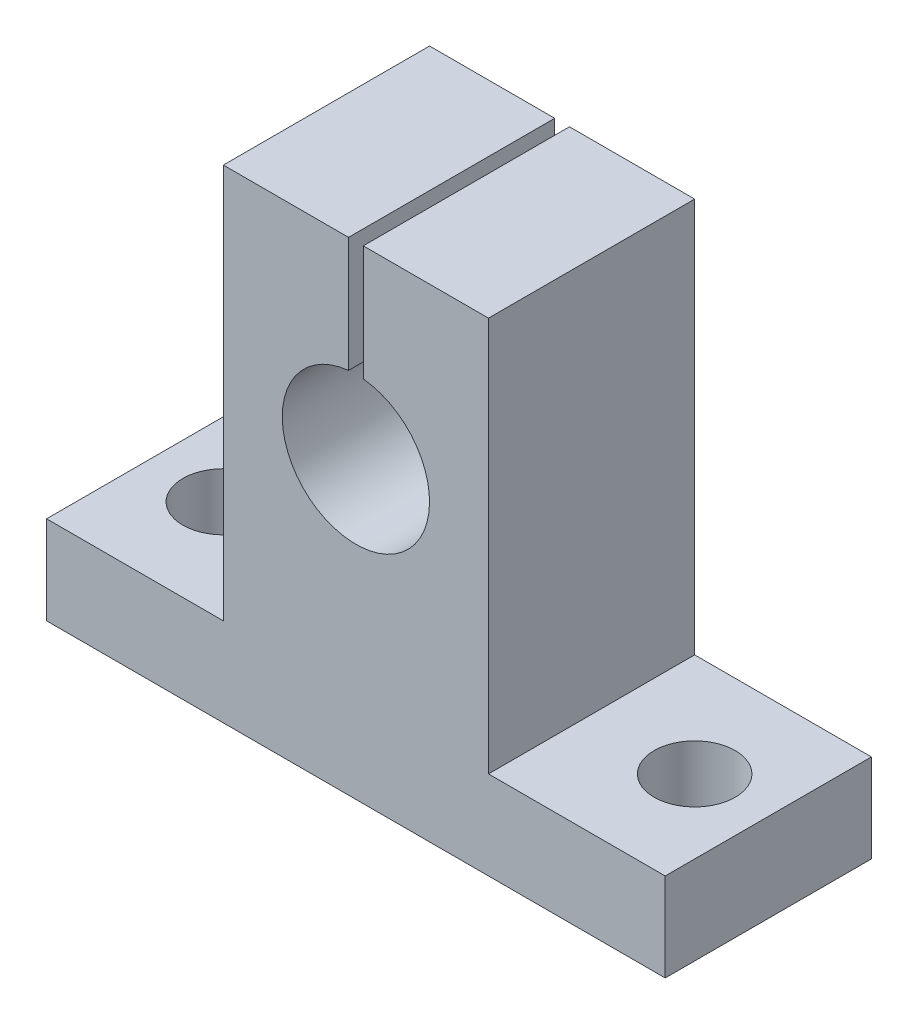
ISO-10303-21;
HEADER;
FILE_DESCRIPTION(('STEP AP214'),'2;1');
FILE_NAME('part.step','',(''),(''),'','','');
FILE_SCHEMA(('AUTOMOTIVE_DESIGN { 1 0 10303 214 1 1 1 1 }'));
ENDSEC;
DATA;
#1=APPLICATION_CONTEXT('core data for automotive mechanical design processes');
#2=APPLICATION_PROTOCOL_DEFINITION('international standard','automotive_design',2000,#1);
#3=PRODUCT_CONTEXT('',#1,'mechanical');
#4=PRODUCT('Part','Part','',(#3));
#5=PRODUCT_RELATED_PRODUCT_CATEGORY('part','',(#4));
#6=PRODUCT_DEFINITION_FORMATION('','',#4);
#7=PRODUCT_DEFINITION_CONTEXT('part definition',#1,'design');
#8=PRODUCT_DEFINITION('design','',#6,#7);
#9=PRODUCT_DEFINITION_SHAPE('','',#8);
#10=(LENGTH_UNIT() NAMED_UNIT(*) SI_UNIT(.MILLI.,.METRE.));
#11=(NAMED_UNIT(*) PLANE_ANGLE_UNIT() SI_UNIT($,.RADIAN.));
#12=(NAMED_UNIT(*) SI_UNIT($,.STERADIAN.) SOLID_ANGLE_UNIT());
#13=UNCERTAINTY_MEASURE_WITH_UNIT(LENGTH_MEASURE(1.E-05),#10,'distance_accuracy_value','');
#14=(GEOMETRIC_REPRESENTATION_CONTEXT(3) GLOBAL_UNCERTAINTY_ASSIGNED_CONTEXT((#13)) GLOBAL_UNIT_ASSIGNED_CONTEXT((#10,
#11,#12)) REPRESENTATION_CONTEXT('',''));
#15=CARTESIAN_POINT('',(0.,0.,0.));
#16=DIRECTION('',(0.,0.,1.));
#17=DIRECTION('',(1.,0.,0.));
#18=AXIS2_PLACEMENT_3D('',#15,#16,#17);
#19=CARTESIAN_POINT('',(0.,0.,14.));
#20=DIRECTION('',(0.,0.,-1.));
#21=DIRECTION('',(-1.,0.,0.));
#22=AXIS2_PLACEMENT_3D('',#19,#20,#21);
#23=CYLINDRICAL_SURFACE('',#22,5.);
#24=CARTESIAN_POINT('',(0.,0.,0.));
#25=DIRECTION('',(0.,0.,1.));
#26=DIRECTION('',(1.,0.,0.));
#27=AXIS2_PLACEMENT_3D('',#24,#25,#26);
#28=CIRCLE('',#27,5.);
#29=CARTESIAN_POINT('',(-0.5,4.9749371855331,0.));
#30=VERTEX_POINT('',#29);
#31=CARTESIAN_POINT('',(0.5,4.9749371855331,0.));
#32=VERTEX_POINT('',#31);
#33=EDGE_CURVE('E176',#30,#32,#28,.T.);
#34=ORIENTED_EDGE('',*,*,#33,.F.);
#35=DIRECTION('',(0.,0.,-1.));
#36=VECTOR('',#35,1.);
#37=CARTESIAN_POINT('',(-0.5,4.9749371855331,14.));
#38=LINE('',#37,#36);
#39=CARTESIAN_POINT('',(-0.5,4.9749371855331,14.));
#40=VERTEX_POINT('',#39);
#41=EDGE_CURVE('E11',#40,#30,#38,.T.);
#42=ORIENTED_EDGE('',*,*,#41,.F.);
#43=CARTESIAN_POINT('',(0.,0.,14.));
#44=DIRECTION('',(0.,0.,1.));
#45=DIRECTION('',(1.,0.,0.));
#46=AXIS2_PLACEMENT_3D('',#43,#44,#45);
#47=CIRCLE('',#46,5.);
#48=CARTESIAN_POINT('',(0.5,4.9749371855331,14.));
#49=VERTEX_POINT('',#48);
#50=EDGE_CURVE('E163',#40,#49,#47,.T.);
#51=ORIENTED_EDGE('',*,*,#50,.T.);
#52=DIRECTION('',(0.,0.,-1.));
#53=VECTOR('',#52,1.);
#54=CARTESIAN_POINT('',(0.5,4.9749371855331,14.));
#55=LINE('',#54,#53);
#56=EDGE_CURVE('E53',#49,#32,#55,.T.);
#57=ORIENTED_EDGE('',*,*,#56,.T.);
#58=EDGE_LOOP('',(#34,#42,#51,#57));
#59=FACE_BOUND('',#58,.T.);
#60=ADVANCED_FACE('F37',(#59),#23,.F.);
#61=CARTESIAN_POINT('',(-0.5,0.,14.));
#62=DIRECTION('',(1.,0.,0.));
#63=DIRECTION('',(0.,0.,-1.));
#64=AXIS2_PLACEMENT_3D('',#61,#62,#63);
#65=PLANE('',#64);
#66=DIRECTION('',(0.,-1.,0.));
#67=VECTOR('',#66,1.);
#68=CARTESIAN_POINT('',(-0.5,0.,0.));
#69=LINE('',#68,#67);
#70=CARTESIAN_POINT('',(-0.5,12.8,0.));
#71=VERTEX_POINT('',#70);
#72=EDGE_CURVE('E235',#71,#30,#69,.T.);
#73=ORIENTED_EDGE('',*,*,#72,.F.);
#74=DIRECTION('',(0.,0.,-1.));
#75=VECTOR('',#74,1.);
#76=CARTESIAN_POINT('',(-0.5,12.8,14.));
#77=LINE('',#76,#75);
#78=CARTESIAN_POINT('',(-0.5,12.8,14.));
#79=VERTEX_POINT('',#78);
#80=EDGE_CURVE('E45',#79,#71,#77,.T.);
#81=ORIENTED_EDGE('',*,*,#80,.F.);
#82=DIRECTION('',(0.,-1.,0.));
#83=VECTOR('',#82,1.);
#84=CARTESIAN_POINT('',(-0.5,0.,14.));
#85=LINE('',#84,#83);
#86=EDGE_CURVE('E157',#79,#40,#85,.T.);
#87=ORIENTED_EDGE('',*,*,#86,.T.);
#88=ORIENTED_EDGE('',*,*,#41,.T.);
#89=EDGE_LOOP('',(#73,#81,#87,#88));
#90=FACE_BOUND('',#89,.T.);
#91=ADVANCED_FACE('F236',(#90),#65,.T.);
#92=CARTESIAN_POINT('',(0.,12.8,14.));
#93=DIRECTION('',(0.,1.,0.));
#94=DIRECTION('',(0.,0.,1.));
#95=AXIS2_PLACEMENT_3D('',#92,#93,#94);
#96=PLANE('',#95);
#97=DIRECTION('',(1.,0.,0.));
#98=VECTOR('',#97,1.);
#99=CARTESIAN_POINT('',(0.,12.8,0.));
#100=LINE('',#99,#98);
#101=CARTESIAN_POINT('',(-9.,12.8,0.));
#102=VERTEX_POINT('',#101);
#103=EDGE_CURVE('E212',#102,#71,#100,.T.);
#104=ORIENTED_EDGE('',*,*,#103,.F.);
#105=DIRECTION('',(0.,0.,-1.));
#106=VECTOR('',#105,1.);
#107=CARTESIAN_POINT('',(-9.,12.8,14.));
#108=LINE('',#107,#106);
#109=CARTESIAN_POINT('',(-9.,12.8,14.));
#110=VERTEX_POINT('',#109);
#111=EDGE_CURVE('E228',#110,#102,#108,.T.);
#112=ORIENTED_EDGE('',*,*,#111,.F.);
#113=DIRECTION('',(1.,0.,0.));
#114=VECTOR('',#113,1.);
#115=CARTESIAN_POINT('',(0.,12.8,14.));
#116=LINE('',#115,#114);
#117=EDGE_CURVE('E151',#110,#79,#116,.T.);
#118=ORIENTED_EDGE('',*,*,#117,.T.);
#119=ORIENTED_EDGE('',*,*,#80,.T.);
#120=EDGE_LOOP('',(#104,#112,#118,#119));
#121=FACE_BOUND('',#120,.T.);
#122=ADVANCED_FACE('F231',(#121),#96,.T.);
#123=CARTESIAN_POINT('',(-8.99999999999999,0.,14.));
#124=DIRECTION('',(-1.,0.,0.));
#125=DIRECTION('',(0.,-1.,0.));
#126=AXIS2_PLACEMENT_3D('',#123,#124,#125);
#127=PLANE('',#126);
#128=DIRECTION('',(0.,1.,0.));
#129=VECTOR('',#128,1.);
#130=CARTESIAN_POINT('',(-8.99999999999999,0.,0.));
#131=LINE('',#130,#129);
#132=CARTESIAN_POINT('',(-8.99999999999999,-14.,0.));
#133=VERTEX_POINT('',#132);
#134=EDGE_CURVE('E240',#133,#102,#131,.T.);
#135=ORIENTED_EDGE('',*,*,#134,.F.);
#136=DIRECTION('',(0.,0.,-1.));
#137=VECTOR('',#136,1.);
#138=CARTESIAN_POINT('',(-8.99999999999999,-14.,14.));
#139=LINE('',#138,#137);
#140=CARTESIAN_POINT('',(-8.99999999999999,-14.,14.));
#141=VERTEX_POINT('',#140);
#142=EDGE_CURVE('E226',#141,#133,#139,.T.);
#143=ORIENTED_EDGE('',*,*,#142,.F.);
#144=DIRECTION('',(0.,1.,0.));
#145=VECTOR('',#144,1.);
#146=CARTESIAN_POINT('',(-8.99999999999999,0.,14.));
#147=LINE('',#146,#145);
#148=EDGE_CURVE('E156',#141,#110,#147,.T.);
#149=ORIENTED_EDGE('',*,*,#148,.T.);
#150=ORIENTED_EDGE('',*,*,#111,.T.);
#151=EDGE_LOOP('',(#135,#143,#149,#150));
#152=FACE_BOUND('',#151,.T.);
#153=ADVANCED_FACE('F272',(#152),#127,.T.);
#154=CARTESIAN_POINT('',(0.,-14.,14.));
#155=DIRECTION('',(0.,1.,0.));
#156=DIRECTION('',(0.,0.,1.));
#157=AXIS2_PLACEMENT_3D('',#154,#155,#156);
#158=PLANE('',#157);
#159=CARTESIAN_POINT('',(-16.,-14.,7.));
#160=DIRECTION('',(0.,1.,0.));
#161=DIRECTION('',(0.,0.,1.));
#162=AXIS2_PLACEMENT_3D('',#159,#160,#161);
#163=CIRCLE('',#162,2.75);
#164=CARTESIAN_POINT('',(-16.,-14.,9.75));
#165=VERTEX_POINT('',#164);
#166=EDGE_CURVE('E169',#165,#165,#163,.T.);
#167=ORIENTED_EDGE('',*,*,#166,.F.);
#168=EDGE_LOOP('',(#167));
#169=FACE_BOUND('',#168,.T.);
#170=DIRECTION('',(1.,0.,0.));
#171=VECTOR('',#170,1.);
#172=CARTESIAN_POINT('',(0.,-14.,0.));
#173=LINE('',#172,#171);
#174=CARTESIAN_POINT('',(-21.,-14.,0.));
#175=VERTEX_POINT('',#174);
#176=EDGE_CURVE('E241',#175,#133,#173,.T.);
#177=ORIENTED_EDGE('',*,*,#176,.F.);
#178=DIRECTION('',(0.,0.,-1.));
#179=VECTOR('',#178,1.);
#180=CARTESIAN_POINT('',(-21.,-14.,14.));
#181=LINE('',#180,#179);
#182=CARTESIAN_POINT('',(-21.,-14.,14.));
#183=VERTEX_POINT('',#182);
#184=EDGE_CURVE('E224',#183,#175,#181,.T.);
#185=ORIENTED_EDGE('',*,*,#184,.F.);
#186=DIRECTION('',(1.,0.,0.));
#187=VECTOR('',#186,1.);
#188=CARTESIAN_POINT('',(0.,-14.,14.));
#189=LINE('',#188,#187);
#190=EDGE_CURVE('E161',#183,#141,#189,.T.);
#191=ORIENTED_EDGE('',*,*,#190,.T.);
#192=ORIENTED_EDGE('',*,*,#142,.T.);
#193=EDGE_LOOP('',(#177,#185,#191,#192));
#194=FACE_BOUND('',#193,.T.);
#195=ADVANCED_FACE('F267',(#169,#194),#158,.T.);
#196=CARTESIAN_POINT('',(-21.,0.,14.));
#197=DIRECTION('',(-1.,0.,0.));
#198=DIRECTION('',(0.,0.,1.));
#199=AXIS2_PLACEMENT_3D('',#196,#197,#198);
#200=PLANE('',#199);
#201=DIRECTION('',(0.,1.,0.));
#202=VECTOR('',#201,1.);
#203=CARTESIAN_POINT('',(-21.,0.,0.));
#204=LINE('',#203,#202);
#205=CARTESIAN_POINT('',(-21.,-20.,0.));
#206=VERTEX_POINT('',#205);
#207=EDGE_CURVE('E246',#206,#175,#204,.T.);
#208=ORIENTED_EDGE('',*,*,#207,.F.);
#209=DIRECTION('',(0.,0.,-1.));
#210=VECTOR('',#209,1.);
#211=CARTESIAN_POINT('',(-21.,-20.,14.));
#212=LINE('',#211,#210);
#213=CARTESIAN_POINT('',(-21.,-20.,14.));
#214=VERTEX_POINT('',#213);
#215=EDGE_CURVE('E222',#214,#206,#212,.T.);
#216=ORIENTED_EDGE('',*,*,#215,.F.);
#217=DIRECTION('',(0.,1.,0.));
#218=VECTOR('',#217,1.);
#219=CARTESIAN_POINT('',(-21.,0.,14.));
#220=LINE('',#219,#218);
#221=EDGE_CURVE('E264',#214,#183,#220,.T.);
#222=ORIENTED_EDGE('',*,*,#221,.T.);
#223=ORIENTED_EDGE('',*,*,#184,.T.);
#224=EDGE_LOOP('',(#208,#216,#222,#223));
#225=FACE_BOUND('',#224,.T.);
#226=ADVANCED_FACE('F263',(#225),#200,.T.);
#227=CARTESIAN_POINT('',(0.,-20.,14.));
#228=DIRECTION('',(0.,1.,0.));
#229=DIRECTION('',(-1.,0.,0.));
#230=AXIS2_PLACEMENT_3D('',#227,#228,#229);
#231=PLANE('',#230);
#232=CARTESIAN_POINT('',(16.,-20.,7.));
#233=DIRECTION('',(0.,1.,0.));
#234=DIRECTION('',(0.,0.,1.));
#235=AXIS2_PLACEMENT_3D('',#232,#233,#234);
#236=CIRCLE('',#235,2.75);
#237=CARTESIAN_POINT('',(16.,-20.,9.75));
#238=VERTEX_POINT('',#237);
#239=EDGE_CURVE('E173',#238,#238,#236,.T.);
#240=ORIENTED_EDGE('',*,*,#239,.T.);
#241=EDGE_LOOP('',(#240));
#242=FACE_BOUND('',#241,.T.);
#243=CARTESIAN_POINT('',(-16.,-20.,7.));
#244=DIRECTION('',(0.,1.,0.));
#245=DIRECTION('',(0.,0.,1.));
#246=AXIS2_PLACEMENT_3D('',#243,#244,#245);
#247=CIRCLE('',#246,2.75);
#248=CARTESIAN_POINT('',(-16.,-20.,9.75));
#249=VERTEX_POINT('',#248);
#250=EDGE_CURVE('E172',#249,#249,#247,.T.);
#251=ORIENTED_EDGE('',*,*,#250,.T.);
#252=EDGE_LOOP('',(#251));
#253=FACE_BOUND('',#252,.T.);
#254=DIRECTION('',(1.,0.,0.));
#255=VECTOR('',#254,1.);
#256=CARTESIAN_POINT('',(0.,-20.,0.));
#257=LINE('',#256,#255);
#258=CARTESIAN_POINT('',(21.,-20.,0.));
#259=VERTEX_POINT('',#258);
#260=EDGE_CURVE('E249',#206,#259,#257,.T.);
#261=ORIENTED_EDGE('',*,*,#260,.T.);
#262=DIRECTION('',(0.,0.,-1.));
#263=VECTOR('',#262,1.);
#264=CARTESIAN_POINT('',(21.,-20.,14.));
#265=LINE('',#264,#263);
#266=CARTESIAN_POINT('',(21.,-20.,14.));
#267=VERTEX_POINT('',#266);
#268=EDGE_CURVE('E220',#267,#259,#265,.T.);
#269=ORIENTED_EDGE('',*,*,#268,.F.);
#270=DIRECTION('',(1.,0.,0.));
#271=VECTOR('',#270,1.);
#272=CARTESIAN_POINT('',(0.,-20.,14.));
#273=LINE('',#272,#271);
#274=EDGE_CURVE('E259',#214,#267,#273,.T.);
#275=ORIENTED_EDGE('',*,*,#274,.F.);
#276=ORIENTED_EDGE('',*,*,#215,.T.);
#277=EDGE_LOOP('',(#261,#269,#275,#276));
#278=FACE_BOUND('',#277,.T.);
#279=ADVANCED_FACE('F183',(#242,#253,#278),#231,.F.);
#280=CARTESIAN_POINT('',(21.,0.,14.));
#281=DIRECTION('',(1.,0.,0.));
#282=DIRECTION('',(0.,1.,0.));
#283=AXIS2_PLACEMENT_3D('',#280,#281,#282);
#284=PLANE('',#283);
#285=DIRECTION('',(0.,-1.,0.));
#286=VECTOR('',#285,1.);
#287=CARTESIAN_POINT('',(21.,0.,0.));
#288=LINE('',#287,#286);
#289=CARTESIAN_POINT('',(21.,-14.,0.));
#290=VERTEX_POINT('',#289);
#291=EDGE_CURVE('E205',#290,#259,#288,.T.);
#292=ORIENTED_EDGE('',*,*,#291,.F.);
#293=DIRECTION('',(0.,0.,-1.));
#294=VECTOR('',#293,1.);
#295=CARTESIAN_POINT('',(21.,-14.,14.));
#296=LINE('',#295,#294);
#297=CARTESIAN_POINT('',(21.,-14.,14.));
#298=VERTEX_POINT('',#297);
#299=EDGE_CURVE('E201',#298,#290,#296,.T.);
#300=ORIENTED_EDGE('',*,*,#299,.F.);
#301=DIRECTION('',(0.,-1.,0.));
#302=VECTOR('',#301,1.);
#303=CARTESIAN_POINT('',(21.,0.,14.));
#304=LINE('',#303,#302);
#305=EDGE_CURVE('E256',#298,#267,#304,.T.);
#306=ORIENTED_EDGE('',*,*,#305,.T.);
#307=ORIENTED_EDGE('',*,*,#268,.T.);
#308=EDGE_LOOP('',(#292,#300,#306,#307));
#309=FACE_BOUND('',#308,.T.);
#310=ADVANCED_FACE('F196',(#309),#284,.T.);
#311=CARTESIAN_POINT('',(0.,-14.,14.));
#312=DIRECTION('',(0.,1.,0.));
#313=DIRECTION('',(0.,0.,1.));
#314=AXIS2_PLACEMENT_3D('',#311,#312,#313);
#315=PLANE('',#314);
#316=CARTESIAN_POINT('',(16.,-14.,7.));
#317=DIRECTION('',(0.,1.,0.));
#318=DIRECTION('',(0.,0.,1.));
#319=AXIS2_PLACEMENT_3D('',#316,#317,#318);
#320=CIRCLE('',#319,2.75);
#321=CARTESIAN_POINT('',(16.,-14.,9.75));
#322=VERTEX_POINT('',#321);
#323=EDGE_CURVE('E177',#322,#322,#320,.T.);
#324=ORIENTED_EDGE('',*,*,#323,.F.);
#325=EDGE_LOOP('',(#324));
#326=FACE_BOUND('',#325,.T.);
#327=DIRECTION('',(1.,0.,0.));
#328=VECTOR('',#327,1.);
#329=CARTESIAN_POINT('',(0.,-14.,0.));
#330=LINE('',#329,#328);
#331=CARTESIAN_POINT('',(9.00000000000001,-14.,0.));
#332=VERTEX_POINT('',#331);
#333=EDGE_CURVE('E200',#332,#290,#330,.T.);
#334=ORIENTED_EDGE('',*,*,#333,.F.);
#335=DIRECTION('',(0.,0.,-1.));
#336=VECTOR('',#335,1.);
#337=CARTESIAN_POINT('',(9.00000000000001,-14.,14.));
#338=LINE('',#337,#336);
#339=CARTESIAN_POINT('',(9.00000000000001,-14.,14.));
#340=VERTEX_POINT('',#339);
#341=EDGE_CURVE('E136',#340,#332,#338,.T.);
#342=ORIENTED_EDGE('',*,*,#341,.F.);
#343=DIRECTION('',(1.,0.,0.));
#344=VECTOR('',#343,1.);
#345=CARTESIAN_POINT('',(0.,-14.,14.));
#346=LINE('',#345,#344);
#347=EDGE_CURVE('E146',#340,#298,#346,.T.);
#348=ORIENTED_EDGE('',*,*,#347,.T.);
#349=ORIENTED_EDGE('',*,*,#299,.T.);
#350=EDGE_LOOP('',(#334,#342,#348,#349));
#351=FACE_BOUND('',#350,.T.);
#352=ADVANCED_FACE('F193',(#326,#351),#315,.T.);
#353=CARTESIAN_POINT('',(9.00000000000001,0.,14.));
#354=DIRECTION('',(1.,0.,0.));
#355=DIRECTION('',(0.,1.,0.));
#356=AXIS2_PLACEMENT_3D('',#353,#354,#355);
#357=PLANE('',#356);
#358=DIRECTION('',(0.,-1.,0.));
#359=VECTOR('',#358,1.);
#360=CARTESIAN_POINT('',(9.00000000000001,0.,0.));
#361=LINE('',#360,#359);
#362=CARTESIAN_POINT('',(9.,12.8,0.));
#363=VERTEX_POINT('',#362);
#364=EDGE_CURVE('E132',#363,#332,#361,.T.);
#365=ORIENTED_EDGE('',*,*,#364,.F.);
#366=DIRECTION('',(0.,0.,-1.));
#367=VECTOR('',#366,1.);
#368=CARTESIAN_POINT('',(9.,12.8,14.));
#369=LINE('',#368,#367);
#370=CARTESIAN_POINT('',(9.,12.8,14.));
#371=VERTEX_POINT('',#370);
#372=EDGE_CURVE('E127',#371,#363,#369,.T.);
#373=ORIENTED_EDGE('',*,*,#372,.F.);
#374=DIRECTION('',(0.,-1.,0.));
#375=VECTOR('',#374,1.);
#376=CARTESIAN_POINT('',(9.00000000000001,0.,14.));
#377=LINE('',#376,#375);
#378=EDGE_CURVE('E130',#371,#340,#377,.T.);
#379=ORIENTED_EDGE('',*,*,#378,.T.);
#380=ORIENTED_EDGE('',*,*,#341,.T.);
#381=EDGE_LOOP('',(#365,#373,#379,#380));
#382=FACE_BOUND('',#381,.T.);
#383=ADVANCED_FACE('F129',(#382),#357,.T.);
#384=CARTESIAN_POINT('',(0.5,12.8,0.));
#385=VERTEX_POINT('',#384);
#386=EDGE_CURVE('E209',#385,#363,#100,.T.);
#387=ORIENTED_EDGE('',*,*,#386,.F.);
#388=DIRECTION('',(0.,0.,-1.));
#389=VECTOR('',#388,1.);
#390=CARTESIAN_POINT('',(0.5,12.8,14.));
#391=LINE('',#390,#389);
#392=CARTESIAN_POINT('',(0.5,12.8,14.));
#393=VERTEX_POINT('',#392);
#394=EDGE_CURVE('E90',#393,#385,#391,.T.);
#395=ORIENTED_EDGE('',*,*,#394,.F.);
#396=EDGE_CURVE('E143',#393,#371,#116,.T.);
#397=ORIENTED_EDGE('',*,*,#396,.T.);
#398=ORIENTED_EDGE('',*,*,#372,.T.);
#399=EDGE_LOOP('',(#387,#395,#397,#398));
#400=FACE_BOUND('',#399,.T.);
#401=ADVANCED_FACE('F148',(#400),#96,.T.);
#402=CARTESIAN_POINT('',(0.5,0.,14.));
#403=DIRECTION('',(-1.,0.,0.));
#404=DIRECTION('',(0.,0.,1.));
#405=AXIS2_PLACEMENT_3D('',#402,#403,#404);
#406=PLANE('',#405);
#407=DIRECTION('',(0.,1.,0.));
#408=VECTOR('',#407,1.);
#409=CARTESIAN_POINT('',(0.5,0.,0.));
#410=LINE('',#409,#408);
#411=EDGE_CURVE('E166',#32,#385,#410,.T.);
#412=ORIENTED_EDGE('',*,*,#411,.F.);
#413=ORIENTED_EDGE('',*,*,#56,.F.);
#414=DIRECTION('',(0.,1.,0.));
#415=VECTOR('',#414,1.);
#416=CARTESIAN_POINT('',(0.5,0.,14.));
#417=LINE('',#416,#415);
#418=EDGE_CURVE('E149',#49,#393,#417,.T.);
#419=ORIENTED_EDGE('',*,*,#418,.T.);
#420=ORIENTED_EDGE('',*,*,#394,.T.);
#421=EDGE_LOOP('',(#412,#413,#419,#420));
#422=FACE_BOUND('',#421,.T.);
#423=ADVANCED_FACE('F296',(#422),#406,.T.);
#424=CARTESIAN_POINT('',(0.,0.,14.));
#425=DIRECTION('',(0.,0.,1.));
#426=DIRECTION('',(1.,0.,0.));
#427=AXIS2_PLACEMENT_3D('',#424,#425,#426);
#428=PLANE('',#427);
#429=ORIENTED_EDGE('',*,*,#50,.F.);
#430=ORIENTED_EDGE('',*,*,#86,.F.);
#431=ORIENTED_EDGE('',*,*,#117,.F.);
#432=ORIENTED_EDGE('',*,*,#148,.F.);
#433=ORIENTED_EDGE('',*,*,#190,.F.);
#434=ORIENTED_EDGE('',*,*,#221,.F.);
#435=ORIENTED_EDGE('',*,*,#274,.T.);
#436=ORIENTED_EDGE('',*,*,#305,.F.);
#437=ORIENTED_EDGE('',*,*,#347,.F.);
#438=ORIENTED_EDGE('',*,*,#378,.F.);
#439=ORIENTED_EDGE('',*,*,#396,.F.);
#440=ORIENTED_EDGE('',*,*,#418,.F.);
#441=EDGE_LOOP('',(#429,#430,#431,#432,#433,#434,#435,#436,#437,#438,#439,#440));
#442=FACE_BOUND('',#441,.T.);
#443=ADVANCED_FACE('F141',(#442),#428,.T.);
#444=CARTESIAN_POINT('',(0.,0.,0.));
#445=DIRECTION('',(0.,0.,1.));
#446=DIRECTION('',(1.,0.,0.));
#447=AXIS2_PLACEMENT_3D('',#444,#445,#446);
#448=PLANE('',#447);
#449=ORIENTED_EDGE('',*,*,#33,.T.);
#450=ORIENTED_EDGE('',*,*,#411,.T.);
#451=ORIENTED_EDGE('',*,*,#386,.T.);
#452=ORIENTED_EDGE('',*,*,#364,.T.);
#453=ORIENTED_EDGE('',*,*,#333,.T.);
#454=ORIENTED_EDGE('',*,*,#291,.T.);
#455=ORIENTED_EDGE('',*,*,#260,.F.);
#456=ORIENTED_EDGE('',*,*,#207,.T.);
#457=ORIENTED_EDGE('',*,*,#176,.T.);
#458=ORIENTED_EDGE('',*,*,#134,.T.);
#459=ORIENTED_EDGE('',*,*,#103,.T.);
#460=ORIENTED_EDGE('',*,*,#72,.T.);
#461=EDGE_LOOP('',(#449,#450,#451,#452,#453,#454,#455,#456,#457,#458,#459,#460));
#462=FACE_BOUND('',#461,.T.);
#463=ADVANCED_FACE('F207',(#462),#448,.F.);
#464=CARTESIAN_POINT('',(-16.,-20.,7.));
#465=DIRECTION('',(0.,1.,0.));
#466=DIRECTION('',(0.,0.,1.));
#467=AXIS2_PLACEMENT_3D('',#464,#465,#466);
#468=CYLINDRICAL_SURFACE('',#467,2.75);
#469=ORIENTED_EDGE('',*,*,#250,.F.);
#470=EDGE_LOOP('',(#469));
#471=FACE_BOUND('',#470,.T.);
#472=ORIENTED_EDGE('',*,*,#166,.T.);
#473=EDGE_LOOP('',(#472));
#474=FACE_BOUND('',#473,.T.);
#475=ADVANCED_FACE('F189',(#471,#474),#468,.F.);
#476=CARTESIAN_POINT('',(16.,-20.,7.));
#477=DIRECTION('',(0.,1.,0.));
#478=DIRECTION('',(0.,0.,1.));
#479=AXIS2_PLACEMENT_3D('',#476,#477,#478);
#480=CYLINDRICAL_SURFACE('',#479,2.75);
#481=ORIENTED_EDGE('',*,*,#239,.F.);
#482=EDGE_LOOP('',(#481));
#483=FACE_BOUND('',#482,.T.);
#484=ORIENTED_EDGE('',*,*,#323,.T.);
#485=EDGE_LOOP('',(#484));
#486=FACE_BOUND('',#485,.T.);
#487=ADVANCED_FACE('F186',(#483,#486),#480,.F.);
#488=CLOSED_SHELL('',(#60,#91,#122,#153,#195,#226,#279,#310,#352,#383,#401,#423,#443,#463,#475,#487));
#489=MANIFOLD_SOLID_BREP('B2',#488);
#490=ADVANCED_BREP_SHAPE_REPRESENTATION('',(#18,#489),#14);
#491=SHAPE_DEFINITION_REPRESENTATION(#9,#490);
ENDSEC;
END-ISO-10303-21;
